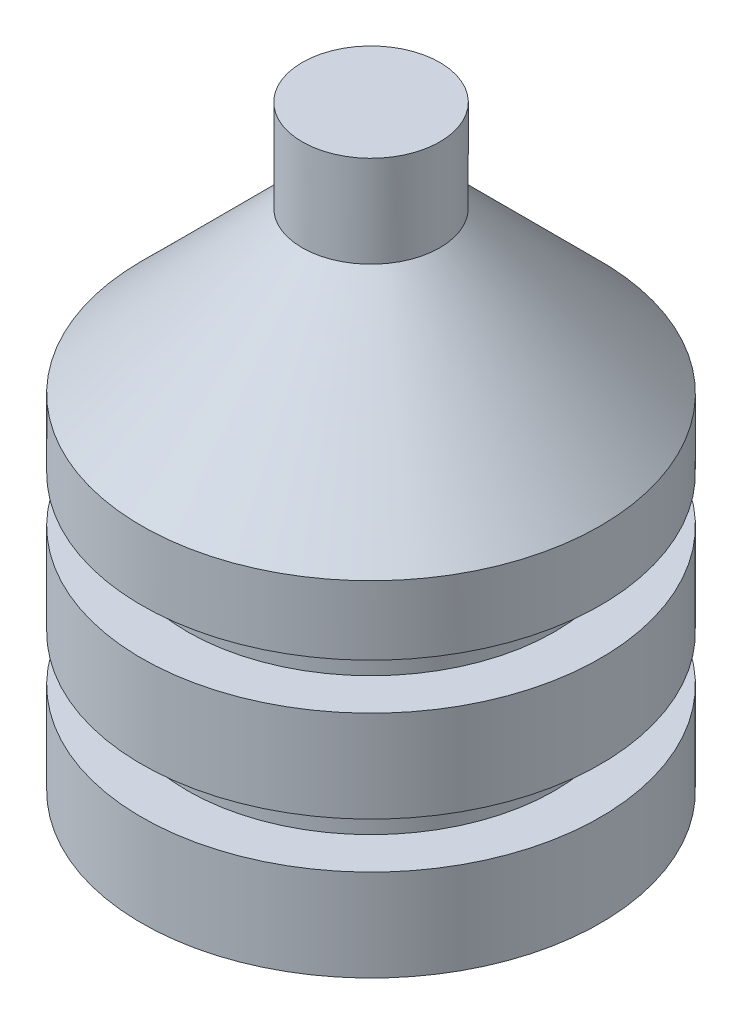
ISO-10303-21;
HEADER;
FILE_DESCRIPTION(('STEP AP214'),'2;1');
FILE_NAME('part.step','',(''),(''),'','','');
FILE_SCHEMA(('AUTOMOTIVE_DESIGN { 1 0 10303 214 1 1 1 1 }'));
ENDSEC;
DATA;
#1=APPLICATION_CONTEXT('core data for automotive mechanical design processes');
#2=APPLICATION_PROTOCOL_DEFINITION('international standard','automotive_design',2000,#1);
#3=PRODUCT_CONTEXT('',#1,'mechanical');
#4=PRODUCT('Part','Part','',(#3));
#5=PRODUCT_RELATED_PRODUCT_CATEGORY('part','',(#4));
#6=PRODUCT_DEFINITION_FORMATION('','',#4);
#7=PRODUCT_DEFINITION_CONTEXT('part definition',#1,'design');
#8=PRODUCT_DEFINITION('design','',#6,#7);
#9=PRODUCT_DEFINITION_SHAPE('','',#8);
#10=(LENGTH_UNIT() NAMED_UNIT(*) SI_UNIT(.MILLI.,.METRE.));
#11=(NAMED_UNIT(*) PLANE_ANGLE_UNIT() SI_UNIT($,.RADIAN.));
#12=(NAMED_UNIT(*) SI_UNIT($,.STERADIAN.) SOLID_ANGLE_UNIT());
#13=UNCERTAINTY_MEASURE_WITH_UNIT(LENGTH_MEASURE(1.E-05),#10,'distance_accuracy_value','');
#14=(GEOMETRIC_REPRESENTATION_CONTEXT(3) GLOBAL_UNCERTAINTY_ASSIGNED_CONTEXT((#13)) GLOBAL_UNIT_ASSIGNED_CONTEXT((#10,
#11,#12)) REPRESENTATION_CONTEXT('',''));
#15=CARTESIAN_POINT('',(0.,0.,0.));
#16=DIRECTION('',(0.,0.,1.));
#17=DIRECTION('',(1.,0.,0.));
#18=AXIS2_PLACEMENT_3D('',#15,#16,#17);
#19=CARTESIAN_POINT('',(0.,113.59375,0.));
#20=DIRECTION('',(0.,1.,0.));
#21=DIRECTION('',(-1.,0.,0.));
#22=AXIS2_PLACEMENT_3D('',#19,#20,#21);
#23=CYLINDRICAL_SURFACE('',#22,50.);
#24=CARTESIAN_POINT('',(0.,-16.4062500000001,0.));
#25=DIRECTION('',(0.,1.,0.));
#26=DIRECTION('',(-1.,0.,0.));
#27=AXIS2_PLACEMENT_3D('',#24,#25,#26);
#28=CIRCLE('',#27,50.);
#29=CARTESIAN_POINT('',(-50.,-16.4062500000001,0.));
#30=VERTEX_POINT('',#29);
#31=EDGE_CURVE('E10',#30,#30,#28,.T.);
#32=ORIENTED_EDGE('',*,*,#31,.T.);
#33=EDGE_LOOP('',(#32));
#34=FACE_BOUND('',#33,.T.);
#35=CARTESIAN_POINT('',(0.,3.59374999999991,0.));
#36=DIRECTION('',(0.,1.,0.));
#37=DIRECTION('',(-1.,0.,0.));
#38=AXIS2_PLACEMENT_3D('',#35,#36,#37);
#39=CIRCLE('',#38,50.);
#40=CARTESIAN_POINT('',(-50.,3.5937499999999,0.));
#41=VERTEX_POINT('',#40);
#42=EDGE_CURVE('E73',#41,#41,#39,.T.);
#43=ORIENTED_EDGE('',*,*,#42,.F.);
#44=EDGE_LOOP('',(#43));
#45=FACE_BOUND('',#44,.T.);
#46=ADVANCED_FACE('F33',(#34,#45),#23,.T.);
#47=CARTESIAN_POINT('',(0.,-16.4062500000001,0.));
#48=DIRECTION('',(0.,-1.,0.));
#49=DIRECTION('',(1.,0.,0.));
#50=AXIS2_PLACEMENT_3D('',#47,#48,#49);
#51=PLANE('',#50);
#52=ORIENTED_EDGE('',*,*,#31,.F.);
#53=EDGE_LOOP('',(#52));
#54=FACE_BOUND('',#53,.T.);
#55=ADVANCED_FACE('F81',(#54),#51,.T.);
#56=CARTESIAN_POINT('',(0.,113.59375,0.));
#57=DIRECTION('',(0.,1.,0.));
#58=DIRECTION('',(-1.,0.,0.));
#59=AXIS2_PLACEMENT_3D('',#56,#57,#58);
#60=PLANE('',#59);
#61=CARTESIAN_POINT('',(0.,113.59375,0.));
#62=DIRECTION('',(0.,1.,0.));
#63=DIRECTION('',(-1.,0.,0.));
#64=AXIS2_PLACEMENT_3D('',#61,#62,#63);
#65=CIRCLE('',#64,15.);
#66=CARTESIAN_POINT('',(-15.,113.59375,0.));
#67=VERTEX_POINT('',#66);
#68=EDGE_CURVE('E39',#67,#67,#65,.T.);
#69=ORIENTED_EDGE('',*,*,#68,.T.);
#70=EDGE_LOOP('',(#69));
#71=FACE_BOUND('',#70,.T.);
#72=ADVANCED_FACE('F85',(#71),#60,.T.);
#73=CARTESIAN_POINT('',(0.,113.59375,0.));
#74=DIRECTION('',(0.,1.,0.));
#75=DIRECTION('',(-1.,0.,0.));
#76=AXIS2_PLACEMENT_3D('',#73,#74,#75);
#77=CYLINDRICAL_SURFACE('',#76,15.);
#78=CARTESIAN_POINT('',(0.,93.5937499999999,0.));
#79=DIRECTION('',(0.,1.,0.));
#80=DIRECTION('',(-1.,0.,0.));
#81=AXIS2_PLACEMENT_3D('',#78,#79,#80);
#82=CIRCLE('',#81,15.);
#83=CARTESIAN_POINT('',(15.,93.5937499999999,0.));
#84=VERTEX_POINT('',#83);
#85=EDGE_CURVE('E43',#84,#84,#82,.T.);
#86=ORIENTED_EDGE('',*,*,#85,.T.);
#87=EDGE_LOOP('',(#86));
#88=FACE_BOUND('',#87,.T.);
#89=ORIENTED_EDGE('',*,*,#68,.F.);
#90=EDGE_LOOP('',(#89));
#91=FACE_BOUND('',#90,.T.);
#92=ADVANCED_FACE('F90',(#88,#91),#77,.T.);
#93=CARTESIAN_POINT('',(0.,93.5937499999999,0.));
#94=DIRECTION('',(0.,-1.,0.));
#95=DIRECTION('',(1.,0.,0.));
#96=AXIS2_PLACEMENT_3D('',#93,#94,#95);
#97=CONICAL_SURFACE('',#96,15.,0.785398163397448);
#98=CARTESIAN_POINT('',(0.,58.5937499999999,0.));
#99=DIRECTION('',(0.,1.,0.));
#100=DIRECTION('',(-1.,0.,0.));
#101=AXIS2_PLACEMENT_3D('',#98,#99,#100);
#102=CIRCLE('',#101,50.);
#103=CARTESIAN_POINT('',(50.,58.5937499999999,0.));
#104=VERTEX_POINT('',#103);
#105=EDGE_CURVE('E47',#104,#104,#102,.T.);
#106=CARTESIAN_POINT('',(50.,58.5937499999999,0.));
#107=CARTESIAN_POINT('',(49.6354166666666,58.9583333333333,0.));
#108=CARTESIAN_POINT('',(49.2708333333333,59.3229166666666,0.));
#109=CARTESIAN_POINT('',(48.5416666666666,60.0520833333333,0.));
#110=CARTESIAN_POINT('',(48.1770833333333,60.4166666666666,0.));
#111=CARTESIAN_POINT('',(47.4479166666666,61.1458333333333,0.));
#112=CARTESIAN_POINT('',(47.0833333333333,61.5104166666666,0.));
#113=CARTESIAN_POINT('',(46.3541666666666,62.2395833333333,0.));
#114=CARTESIAN_POINT('',(45.9895833333333,62.6041666666666,0.));
#115=CARTESIAN_POINT('',(45.2604166666666,63.3333333333333,0.));
#116=CARTESIAN_POINT('',(44.8958333333333,63.6979166666666,0.));
#117=CARTESIAN_POINT('',(44.1666666666666,64.4270833333333,0.));
#118=CARTESIAN_POINT('',(43.8020833333333,64.7916666666666,0.));
#119=CARTESIAN_POINT('',(43.0729166666666,65.5208333333333,0.));
#120=CARTESIAN_POINT('',(42.7083333333333,65.8854166666666,0.));
#121=CARTESIAN_POINT('',(41.9791666666666,66.6145833333333,0.));
#122=CARTESIAN_POINT('',(41.6145833333333,66.9791666666666,0.));
#123=CARTESIAN_POINT('',(40.8854166666666,67.7083333333333,0.));
#124=CARTESIAN_POINT('',(40.5208333333333,68.0729166666666,0.));
#125=CARTESIAN_POINT('',(39.7916666666666,68.8020833333333,0.));
#126=CARTESIAN_POINT('',(39.4270833333333,69.1666666666666,0.));
#127=CARTESIAN_POINT('',(38.6979166666666,69.8958333333333,0.));
#128=CARTESIAN_POINT('',(38.3333333333333,70.2604166666666,0.));
#129=CARTESIAN_POINT('',(37.6041666666666,70.9895833333333,0.));
#130=CARTESIAN_POINT('',(37.2395833333333,71.3541666666666,0.));
#131=CARTESIAN_POINT('',(36.5104166666666,72.0833333333333,0.));
#132=CARTESIAN_POINT('',(36.1458333333333,72.4479166666666,0.));
#133=CARTESIAN_POINT('',(35.4166666666666,73.1770833333333,0.));
#134=CARTESIAN_POINT('',(35.0520833333333,73.5416666666666,0.));
#135=CARTESIAN_POINT('',(34.3229166666666,74.2708333333333,0.));
#136=CARTESIAN_POINT('',(33.9583333333333,74.6354166666666,0.));
#137=CARTESIAN_POINT('',(33.2291666666666,75.3645833333333,0.));
#138=CARTESIAN_POINT('',(32.8645833333333,75.7291666666666,0.));
#139=CARTESIAN_POINT('',(32.1354166666666,76.4583333333333,0.));
#140=CARTESIAN_POINT('',(31.7708333333333,76.8229166666666,0.));
#141=CARTESIAN_POINT('',(31.0416666666666,77.5520833333333,0.));
#142=CARTESIAN_POINT('',(30.6770833333333,77.9166666666666,0.));
#143=CARTESIAN_POINT('',(29.9479166666666,78.6458333333332,0.));
#144=CARTESIAN_POINT('',(29.5833333333333,79.0104166666666,0.));
#145=CARTESIAN_POINT('',(28.8541666666666,79.7395833333333,0.));
#146=CARTESIAN_POINT('',(28.4895833333333,80.1041666666666,0.));
#147=CARTESIAN_POINT('',(27.7604166666666,80.8333333333333,0.));
#148=CARTESIAN_POINT('',(27.3958333333333,81.1979166666666,0.));
#149=CARTESIAN_POINT('',(26.6666666666666,81.9270833333333,0.));
#150=CARTESIAN_POINT('',(26.3020833333333,82.2916666666666,0.));
#151=CARTESIAN_POINT('',(25.5729166666666,83.0208333333333,0.));
#152=CARTESIAN_POINT('',(25.2083333333333,83.3854166666666,0.));
#153=CARTESIAN_POINT('',(24.4791666666666,84.1145833333333,0.));
#154=CARTESIAN_POINT('',(24.1145833333333,84.4791666666666,0.));
#155=CARTESIAN_POINT('',(23.3854166666666,85.2083333333332,0.));
#156=CARTESIAN_POINT('',(23.0208333333333,85.5729166666666,0.));
#157=CARTESIAN_POINT('',(22.2916666666666,86.3020833333333,0.));
#158=CARTESIAN_POINT('',(21.9270833333333,86.6666666666666,0.));
#159=CARTESIAN_POINT('',(21.1979166666666,87.3958333333333,0.));
#160=CARTESIAN_POINT('',(20.8333333333333,87.7604166666666,0.));
#161=CARTESIAN_POINT('',(20.1041666666666,88.4895833333332,0.));
#162=CARTESIAN_POINT('',(19.7395833333333,88.8541666666666,0.));
#163=CARTESIAN_POINT('',(19.0104166666666,89.5833333333333,0.));
#164=CARTESIAN_POINT('',(18.6458333333333,89.9479166666666,0.));
#165=CARTESIAN_POINT('',(17.9166666666666,90.6770833333332,0.));
#166=CARTESIAN_POINT('',(17.5520833333333,91.0416666666666,0.));
#167=CARTESIAN_POINT('',(16.8229166666666,91.7708333333332,0.));
#168=CARTESIAN_POINT('',(16.4583333333333,92.1354166666666,0.));
#169=CARTESIAN_POINT('',(15.7291666666666,92.8645833333333,0.));
#170=CARTESIAN_POINT('',(15.3645833333333,93.2291666666666,0.));
#171=CARTESIAN_POINT('',(15.,93.5937499999999,0.));
#172=B_SPLINE_CURVE_WITH_KNOTS('',3,(#106,#107,#108,#109,#110,#111,#112,#113,#114,#115,#116,
#117,#118,#119,#120,#121,#122,#123,#124,#125,#126,#127,#128,#129,#130,#131,#132,#133,#134,#135,
#136,#137,#138,#139,#140,#141,#142,#143,#144,#145,#146,#147,#148,#149,#150,#151,#152,#153,#154,
#155,#156,#157,#158,#159,#160,#161,#162,#163,#164,#165,#166,#167,#168,#169,#170,#171),
.UNSPECIFIED.,.F.,.F.,(4,2,2,2,2,2,2,2,2,2,2,2,2,2,2,2,2,2,2,2,2,2,2,2,2,2,2,2,2,2,2,2,4),(0.,
1.54679608384557,3.09359216769115,4.64038825153672,6.18718433538229,7.73398041922785,
9.28077650307343,10.827572586919,12.3743686707646,13.9211647546102,15.4679608384557,
17.0147569223013,18.5615530061469,20.1083490899924,21.655145173838,23.2019412576836,
24.7487373415292,26.2955334253747,27.8423295092203,29.3891255930659,30.9359216769114,
32.482717760757,34.0295138446026,35.5763099284482,37.1231060122937,38.6699020961393,
40.2166981799849,41.7634942638304,43.310290347676,44.8570864315216,46.4038825153672,
47.9506785992127,49.4974746830583),.UNSPECIFIED.);
#173=EDGE_CURVE('BSEAM95',#104,#84,#172,.T.);
#174=ORIENTED_EDGE('',*,*,#105,.T.);
#175=ORIENTED_EDGE('',*,*,#85,.F.);
#176=ORIENTED_EDGE('',*,*,#173,.T.);
#177=ORIENTED_EDGE('',*,*,#173,.F.);
#178=EDGE_LOOP('',(#174,#176,#175,#177));
#179=FACE_BOUND('',#178,.T.);
#180=ADVANCED_FACE('F95',(#179),#97,.T.);
#181=CARTESIAN_POINT('',(0.,113.59375,0.));
#182=DIRECTION('',(0.,1.,0.));
#183=DIRECTION('',(-1.,0.,0.));
#184=AXIS2_PLACEMENT_3D('',#181,#182,#183);
#185=CYLINDRICAL_SURFACE('',#184,50.);
#186=CARTESIAN_POINT('',(0.,43.5937499999999,0.));
#187=DIRECTION('',(0.,1.,0.));
#188=DIRECTION('',(-1.,0.,0.));
#189=AXIS2_PLACEMENT_3D('',#186,#187,#188);
#190=CIRCLE('',#189,50.);
#191=CARTESIAN_POINT('',(-50.,43.5937499999999,0.));
#192=VERTEX_POINT('',#191);
#193=EDGE_CURVE('E52',#192,#192,#190,.T.);
#194=ORIENTED_EDGE('',*,*,#193,.T.);
#195=EDGE_LOOP('',(#194));
#196=FACE_BOUND('',#195,.T.);
#197=ORIENTED_EDGE('',*,*,#105,.F.);
#198=EDGE_LOOP('',(#197));
#199=FACE_BOUND('',#198,.T.);
#200=ADVANCED_FACE('F99',(#196,#199),#185,.T.);
#201=CARTESIAN_POINT('',(0.,43.5937499999999,0.));
#202=DIRECTION('',(0.,-1.,0.));
#203=DIRECTION('',(1.,0.,0.));
#204=AXIS2_PLACEMENT_3D('',#201,#202,#203);
#205=PLANE('',#204);
#206=CARTESIAN_POINT('',(0.,43.5937499999999,0.));
#207=DIRECTION('',(0.,1.,0.));
#208=DIRECTION('',(-1.,0.,0.));
#209=AXIS2_PLACEMENT_3D('',#206,#207,#208);
#210=CIRCLE('',#209,40.);
#211=CARTESIAN_POINT('',(-40.,43.5937499999999,0.));
#212=VERTEX_POINT('',#211);
#213=EDGE_CURVE('E55',#212,#212,#210,.T.);
#214=ORIENTED_EDGE('',*,*,#213,.T.);
#215=EDGE_LOOP('',(#214));
#216=FACE_BOUND('',#215,.T.);
#217=ORIENTED_EDGE('',*,*,#193,.F.);
#218=EDGE_LOOP('',(#217));
#219=FACE_BOUND('',#218,.T.);
#220=ADVANCED_FACE('F103',(#216,#219),#205,.T.);
#221=CARTESIAN_POINT('',(0.,113.59375,0.));
#222=DIRECTION('',(0.,1.,0.));
#223=DIRECTION('',(-1.,0.,0.));
#224=AXIS2_PLACEMENT_3D('',#221,#222,#223);
#225=CYLINDRICAL_SURFACE('',#224,40.);
#226=CARTESIAN_POINT('',(0.,33.5937499999999,0.));
#227=DIRECTION('',(0.,1.,0.));
#228=DIRECTION('',(-1.,0.,0.));
#229=AXIS2_PLACEMENT_3D('',#226,#227,#228);
#230=CIRCLE('',#229,40.);
#231=CARTESIAN_POINT('',(-40.,33.5937499999999,0.));
#232=VERTEX_POINT('',#231);
#233=EDGE_CURVE('E58',#232,#232,#230,.T.);
#234=ORIENTED_EDGE('',*,*,#233,.T.);
#235=EDGE_LOOP('',(#234));
#236=FACE_BOUND('',#235,.T.);
#237=ORIENTED_EDGE('',*,*,#213,.F.);
#238=EDGE_LOOP('',(#237));
#239=FACE_BOUND('',#238,.T.);
#240=ADVANCED_FACE('F107',(#236,#239),#225,.T.);
#241=CARTESIAN_POINT('',(0.,33.5937499999999,0.));
#242=DIRECTION('',(0.,1.,0.));
#243=DIRECTION('',(-1.,0.,0.));
#244=AXIS2_PLACEMENT_3D('',#241,#242,#243);
#245=PLANE('',#244);
#246=CARTESIAN_POINT('',(0.,33.5937499999999,0.));
#247=DIRECTION('',(0.,1.,0.));
#248=DIRECTION('',(-1.,0.,0.));
#249=AXIS2_PLACEMENT_3D('',#246,#247,#248);
#250=CIRCLE('',#249,50.);
#251=CARTESIAN_POINT('',(-50.,33.5937499999999,0.));
#252=VERTEX_POINT('',#251);
#253=EDGE_CURVE('E61',#252,#252,#250,.T.);
#254=ORIENTED_EDGE('',*,*,#253,.T.);
#255=EDGE_LOOP('',(#254));
#256=FACE_BOUND('',#255,.T.);
#257=ORIENTED_EDGE('',*,*,#233,.F.);
#258=EDGE_LOOP('',(#257));
#259=FACE_BOUND('',#258,.T.);
#260=ADVANCED_FACE('F111',(#256,#259),#245,.T.);
#261=CARTESIAN_POINT('',(0.,113.59375,0.));
#262=DIRECTION('',(0.,1.,0.));
#263=DIRECTION('',(-1.,0.,0.));
#264=AXIS2_PLACEMENT_3D('',#261,#262,#263);
#265=CYLINDRICAL_SURFACE('',#264,50.);
#266=CARTESIAN_POINT('',(0.,13.5937499999999,0.));
#267=DIRECTION('',(0.,1.,0.));
#268=DIRECTION('',(-1.,0.,0.));
#269=AXIS2_PLACEMENT_3D('',#266,#267,#268);
#270=CIRCLE('',#269,50.);
#271=CARTESIAN_POINT('',(-50.,13.5937499999999,0.));
#272=VERTEX_POINT('',#271);
#273=EDGE_CURVE('E64',#272,#272,#270,.T.);
#274=ORIENTED_EDGE('',*,*,#273,.T.);
#275=EDGE_LOOP('',(#274));
#276=FACE_BOUND('',#275,.T.);
#277=ORIENTED_EDGE('',*,*,#253,.F.);
#278=EDGE_LOOP('',(#277));
#279=FACE_BOUND('',#278,.T.);
#280=ADVANCED_FACE('F115',(#276,#279),#265,.T.);
#281=CARTESIAN_POINT('',(0.,13.5937499999999,0.));
#282=DIRECTION('',(0.,-1.,0.));
#283=DIRECTION('',(1.,0.,0.));
#284=AXIS2_PLACEMENT_3D('',#281,#282,#283);
#285=PLANE('',#284);
#286=CARTESIAN_POINT('',(0.,13.5937499999999,0.));
#287=DIRECTION('',(0.,1.,0.));
#288=DIRECTION('',(-1.,0.,0.));
#289=AXIS2_PLACEMENT_3D('',#286,#287,#288);
#290=CIRCLE('',#289,40.);
#291=CARTESIAN_POINT('',(-40.,13.5937499999999,0.));
#292=VERTEX_POINT('',#291);
#293=EDGE_CURVE('E67',#292,#292,#290,.T.);
#294=ORIENTED_EDGE('',*,*,#293,.T.);
#295=EDGE_LOOP('',(#294));
#296=FACE_BOUND('',#295,.T.);
#297=ORIENTED_EDGE('',*,*,#273,.F.);
#298=EDGE_LOOP('',(#297));
#299=FACE_BOUND('',#298,.T.);
#300=ADVANCED_FACE('F119',(#296,#299),#285,.T.);
#301=CARTESIAN_POINT('',(0.,113.59375,0.));
#302=DIRECTION('',(0.,1.,0.));
#303=DIRECTION('',(-1.,0.,0.));
#304=AXIS2_PLACEMENT_3D('',#301,#302,#303);
#305=CYLINDRICAL_SURFACE('',#304,40.);
#306=CARTESIAN_POINT('',(0.,3.59374999999991,0.));
#307=DIRECTION('',(0.,1.,0.));
#308=DIRECTION('',(-1.,0.,0.));
#309=AXIS2_PLACEMENT_3D('',#306,#307,#308);
#310=CIRCLE('',#309,40.);
#311=CARTESIAN_POINT('',(-40.,3.5937499999999,0.));
#312=VERTEX_POINT('',#311);
#313=EDGE_CURVE('E70',#312,#312,#310,.T.);
#314=ORIENTED_EDGE('',*,*,#313,.T.);
#315=EDGE_LOOP('',(#314));
#316=FACE_BOUND('',#315,.T.);
#317=ORIENTED_EDGE('',*,*,#293,.F.);
#318=EDGE_LOOP('',(#317));
#319=FACE_BOUND('',#318,.T.);
#320=ADVANCED_FACE('F123',(#316,#319),#305,.T.);
#321=CARTESIAN_POINT('',(0.,3.59374999999992,0.));
#322=DIRECTION('',(0.,1.,0.));
#323=DIRECTION('',(-1.,0.,0.));
#324=AXIS2_PLACEMENT_3D('',#321,#322,#323);
#325=PLANE('',#324);
#326=ORIENTED_EDGE('',*,*,#42,.T.);
#327=EDGE_LOOP('',(#326));
#328=FACE_BOUND('',#327,.T.);
#329=ORIENTED_EDGE('',*,*,#313,.F.);
#330=EDGE_LOOP('',(#329));
#331=FACE_BOUND('',#330,.T.);
#332=ADVANCED_FACE('F77',(#328,#331),#325,.T.);
#333=CLOSED_SHELL('',(#46,#55,#72,#92,#180,#200,#220,#240,#260,#280,#300,#320,#332));
#334=MANIFOLD_SOLID_BREP('B2',#333);
#335=ADVANCED_BREP_SHAPE_REPRESENTATION('',(#18,#334),#14);
#336=SHAPE_DEFINITION_REPRESENTATION(#9,#335);
ENDSEC;
END-ISO-10303-21;
